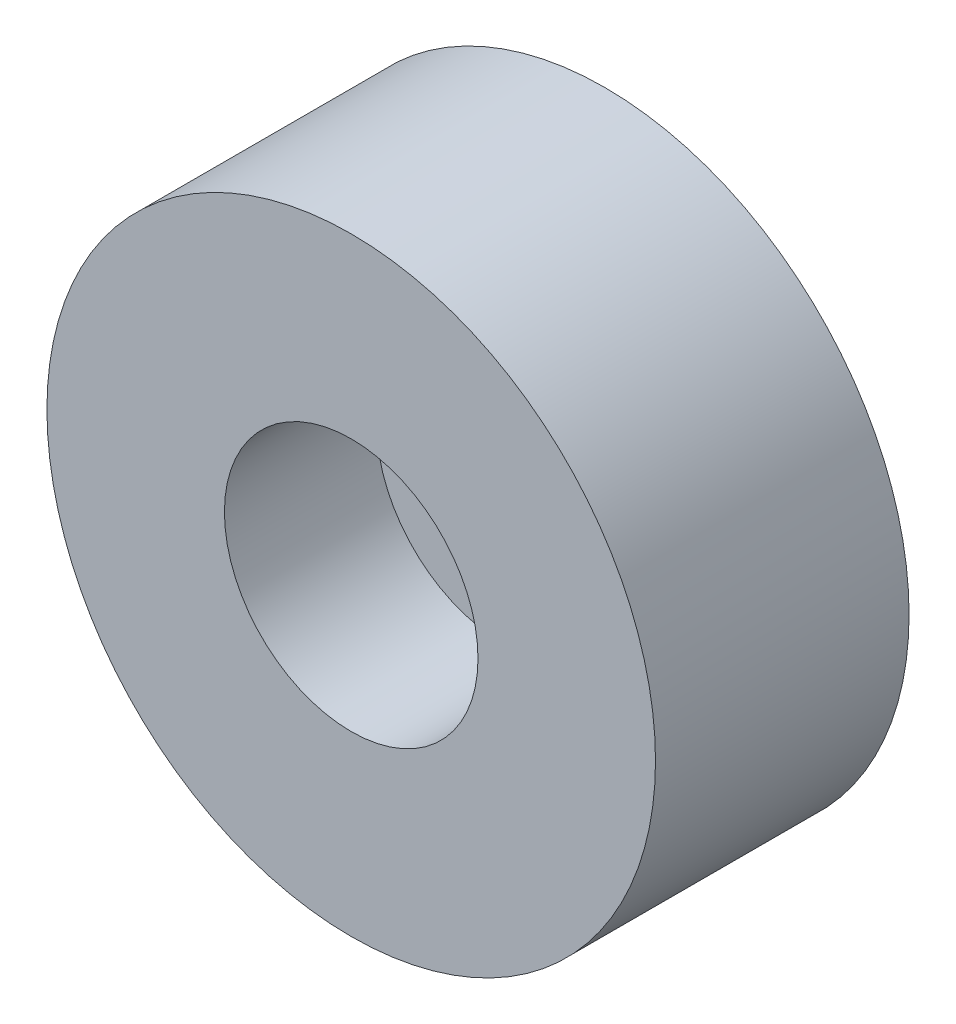
ISO-10303-21;
HEADER;
FILE_DESCRIPTION(('STEP AP214'),'2;1');
FILE_NAME('part.step','',(''),(''),'','','');
FILE_SCHEMA(('AUTOMOTIVE_DESIGN { 1 0 10303 214 1 1 1 1 }'));
ENDSEC;
DATA;
#1=APPLICATION_CONTEXT('core data for automotive mechanical design processes');
#2=APPLICATION_PROTOCOL_DEFINITION('international standard','automotive_design',2000,#1);
#3=PRODUCT_CONTEXT('',#1,'mechanical');
#4=PRODUCT('Part','Part','',(#3));
#5=PRODUCT_RELATED_PRODUCT_CATEGORY('part','',(#4));
#6=PRODUCT_DEFINITION_FORMATION('','',#4);
#7=PRODUCT_DEFINITION_CONTEXT('part definition',#1,'design');
#8=PRODUCT_DEFINITION('design','',#6,#7);
#9=PRODUCT_DEFINITION_SHAPE('','',#8);
#10=(LENGTH_UNIT() NAMED_UNIT(*) SI_UNIT(.MILLI.,.METRE.));
#11=(NAMED_UNIT(*) PLANE_ANGLE_UNIT() SI_UNIT($,.RADIAN.));
#12=(NAMED_UNIT(*) SI_UNIT($,.STERADIAN.) SOLID_ANGLE_UNIT());
#13=UNCERTAINTY_MEASURE_WITH_UNIT(LENGTH_MEASURE(1.E-05),#10,'distance_accuracy_value','');
#14=(GEOMETRIC_REPRESENTATION_CONTEXT(3) GLOBAL_UNCERTAINTY_ASSIGNED_CONTEXT((#13)) GLOBAL_UNIT_ASSIGNED_CONTEXT((#10,
#11,#12)) REPRESENTATION_CONTEXT('',''));
#15=CARTESIAN_POINT('',(0.,0.,0.));
#16=DIRECTION('',(0.,0.,1.));
#17=DIRECTION('',(1.,0.,0.));
#18=AXIS2_PLACEMENT_3D('',#15,#16,#17);
#19=CARTESIAN_POINT('',(0.,0.,5.));
#20=DIRECTION('',(0.,0.,-1.));
#21=DIRECTION('',(-1.,0.,0.));
#22=AXIS2_PLACEMENT_3D('',#19,#20,#21);
#23=CYLINDRICAL_SURFACE('',#22,6.);
#24=CARTESIAN_POINT('',(0.,0.,5.));
#25=DIRECTION('',(0.,0.,1.));
#26=DIRECTION('',(1.,0.,0.));
#27=AXIS2_PLACEMENT_3D('',#24,#25,#26);
#28=CIRCLE('',#27,6.);
#29=CARTESIAN_POINT('',(6.,0.,5.));
#30=VERTEX_POINT('',#29);
#31=EDGE_CURVE('E10',#30,#30,#28,.T.);
#32=ORIENTED_EDGE('',*,*,#31,.F.);
#33=EDGE_LOOP('',(#32));
#34=FACE_BOUND('',#33,.T.);
#35=CARTESIAN_POINT('',(0.,0.,0.));
#36=DIRECTION('',(0.,0.,1.));
#37=DIRECTION('',(1.,0.,0.));
#38=AXIS2_PLACEMENT_3D('',#35,#36,#37);
#39=CIRCLE('',#38,6.);
#40=CARTESIAN_POINT('',(6.,0.,0.));
#41=VERTEX_POINT('',#40);
#42=EDGE_CURVE('E45',#41,#41,#39,.T.);
#43=ORIENTED_EDGE('',*,*,#42,.T.);
#44=EDGE_LOOP('',(#43));
#45=FACE_BOUND('',#44,.T.);
#46=ADVANCED_FACE('F37',(#34,#45),#23,.T.);
#47=CARTESIAN_POINT('',(0.,0.,5.));
#48=DIRECTION('',(0.,0.,1.));
#49=DIRECTION('',(1.,0.,0.));
#50=AXIS2_PLACEMENT_3D('',#47,#48,#49);
#51=PLANE('',#50);
#52=CARTESIAN_POINT('',(0.,0.,5.));
#53=DIRECTION('',(0.,0.,1.));
#54=DIRECTION('',(1.,0.,0.));
#55=AXIS2_PLACEMENT_3D('',#52,#53,#54);
#56=CIRCLE('',#55,2.5);
#57=CARTESIAN_POINT('',(2.5,0.,5.));
#58=VERTEX_POINT('',#57);
#59=EDGE_CURVE('E53',#58,#58,#56,.T.);
#60=ORIENTED_EDGE('',*,*,#59,.F.);
#61=EDGE_LOOP('',(#60));
#62=FACE_BOUND('',#61,.T.);
#63=ORIENTED_EDGE('',*,*,#31,.T.);
#64=EDGE_LOOP('',(#63));
#65=FACE_BOUND('',#64,.T.);
#66=ADVANCED_FACE('F83',(#62,#65),#51,.T.);
#67=CARTESIAN_POINT('',(0.,0.,0.));
#68=DIRECTION('',(0.,0.,1.));
#69=DIRECTION('',(1.,0.,0.));
#70=AXIS2_PLACEMENT_3D('',#67,#68,#69);
#71=PLANE('',#70);
#72=CARTESIAN_POINT('',(0.,0.,0.));
#73=DIRECTION('',(0.,0.,1.));
#74=DIRECTION('',(1.,0.,0.));
#75=AXIS2_PLACEMENT_3D('',#72,#73,#74);
#76=CIRCLE('',#75,1.);
#77=CARTESIAN_POINT('',(1.,0.,0.));
#78=VERTEX_POINT('',#77);
#79=EDGE_CURVE('E40',#78,#78,#76,.T.);
#80=ORIENTED_EDGE('',*,*,#79,.T.);
#81=EDGE_LOOP('',(#80));
#82=FACE_BOUND('',#81,.T.);
#83=ORIENTED_EDGE('',*,*,#42,.F.);
#84=EDGE_LOOP('',(#83));
#85=FACE_BOUND('',#84,.T.);
#86=ADVANCED_FACE('F69',(#82,#85),#71,.F.);
#87=CARTESIAN_POINT('',(0.,0.,2.));
#88=DIRECTION('',(0.,0.,1.));
#89=DIRECTION('',(1.,0.,0.));
#90=AXIS2_PLACEMENT_3D('',#87,#88,#89);
#91=CYLINDRICAL_SURFACE('',#90,2.5);
#92=CARTESIAN_POINT('',(0.,0.,2.));
#93=DIRECTION('',(0.,0.,1.));
#94=DIRECTION('',(1.,0.,0.));
#95=AXIS2_PLACEMENT_3D('',#92,#93,#94);
#96=CIRCLE('',#95,2.5);
#97=CARTESIAN_POINT('',(2.5,0.,2.));
#98=VERTEX_POINT('',#97);
#99=EDGE_CURVE('E51',#98,#98,#96,.T.);
#100=ORIENTED_EDGE('',*,*,#99,.F.);
#101=EDGE_LOOP('',(#100));
#102=FACE_BOUND('',#101,.T.);
#103=ORIENTED_EDGE('',*,*,#59,.T.);
#104=EDGE_LOOP('',(#103));
#105=FACE_BOUND('',#104,.T.);
#106=ADVANCED_FACE('F79',(#102,#105),#91,.F.);
#107=CARTESIAN_POINT('',(0.,0.,2.));
#108=DIRECTION('',(0.,0.,1.));
#109=DIRECTION('',(1.,0.,0.));
#110=AXIS2_PLACEMENT_3D('',#107,#108,#109);
#111=PLANE('',#110);
#112=CARTESIAN_POINT('',(0.,0.,2.));
#113=DIRECTION('',(0.,0.,1.));
#114=DIRECTION('',(1.,0.,0.));
#115=AXIS2_PLACEMENT_3D('',#112,#113,#114);
#116=CIRCLE('',#115,1.);
#117=CARTESIAN_POINT('',(1.,0.,2.));
#118=VERTEX_POINT('',#117);
#119=EDGE_CURVE('E60',#118,#118,#116,.T.);
#120=ORIENTED_EDGE('',*,*,#119,.F.);
#121=EDGE_LOOP('',(#120));
#122=FACE_BOUND('',#121,.T.);
#123=ORIENTED_EDGE('',*,*,#99,.T.);
#124=EDGE_LOOP('',(#123));
#125=FACE_BOUND('',#124,.T.);
#126=ADVANCED_FACE('F74',(#122,#125),#111,.T.);
#127=CARTESIAN_POINT('',(0.,0.,-1.));
#128=DIRECTION('',(0.,0.,1.));
#129=DIRECTION('',(1.,0.,0.));
#130=AXIS2_PLACEMENT_3D('',#127,#128,#129);
#131=CYLINDRICAL_SURFACE('',#130,1.);
#132=ORIENTED_EDGE('',*,*,#119,.T.);
#133=EDGE_LOOP('',(#132));
#134=FACE_BOUND('',#133,.T.);
#135=ORIENTED_EDGE('',*,*,#79,.F.);
#136=EDGE_LOOP('',(#135));
#137=FACE_BOUND('',#136,.T.);
#138=ADVANCED_FACE('F72',(#134,#137),#131,.F.);
#139=CLOSED_SHELL('',(#46,#66,#86,#106,#126,#138));
#140=MANIFOLD_SOLID_BREP('B2',#139);
#141=ADVANCED_BREP_SHAPE_REPRESENTATION('',(#18,#140),#14);
#142=SHAPE_DEFINITION_REPRESENTATION(#9,#141);
ENDSEC;
END-ISO-10303-21;
